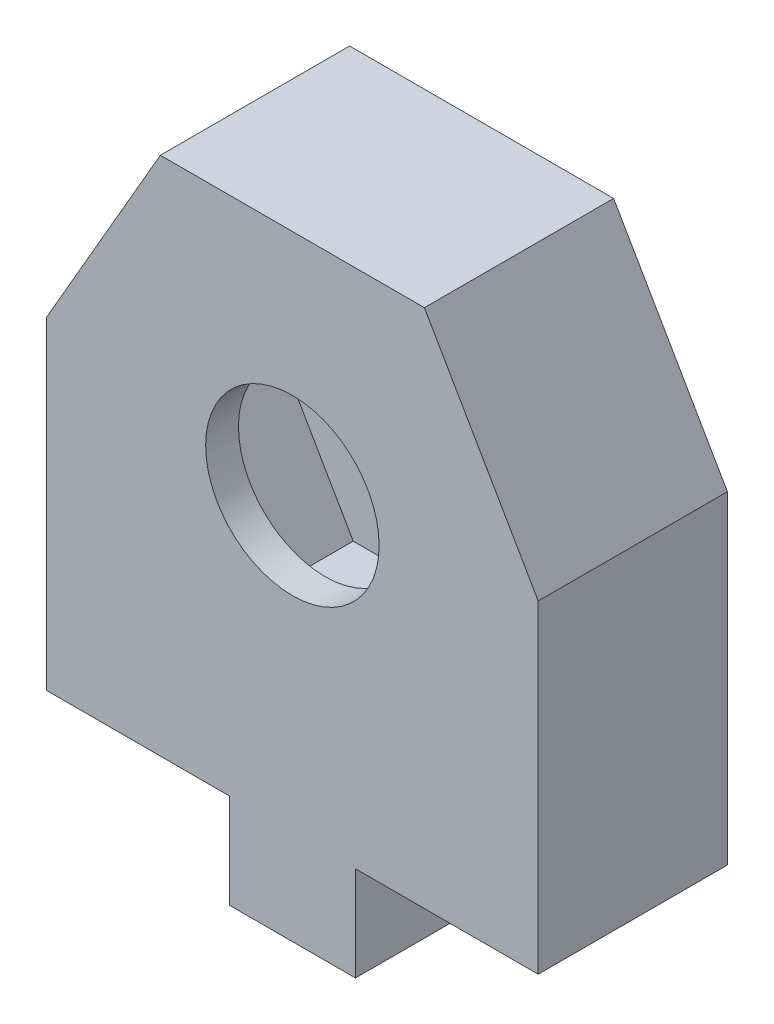
ISO-10303-21;
HEADER;
FILE_DESCRIPTION(('STEP AP214'),'2;1');
FILE_NAME('part.step','',(''),(''),'','','');
FILE_SCHEMA(('AUTOMOTIVE_DESIGN { 1 0 10303 214 1 1 1 1 }'));
ENDSEC;
DATA;
#1=APPLICATION_CONTEXT('core data for automotive mechanical design processes');
#2=APPLICATION_PROTOCOL_DEFINITION('international standard','automotive_design',2000,#1);
#3=PRODUCT_CONTEXT('',#1,'mechanical');
#4=PRODUCT('Part','Part','',(#3));
#5=PRODUCT_RELATED_PRODUCT_CATEGORY('part','',(#4));
#6=PRODUCT_DEFINITION_FORMATION('','',#4);
#7=PRODUCT_DEFINITION_CONTEXT('part definition',#1,'design');
#8=PRODUCT_DEFINITION('design','',#6,#7);
#9=PRODUCT_DEFINITION_SHAPE('','',#8);
#10=(LENGTH_UNIT() NAMED_UNIT(*) SI_UNIT(.MILLI.,.METRE.));
#11=(NAMED_UNIT(*) PLANE_ANGLE_UNIT() SI_UNIT($,.RADIAN.));
#12=(NAMED_UNIT(*) SI_UNIT($,.STERADIAN.) SOLID_ANGLE_UNIT());
#13=UNCERTAINTY_MEASURE_WITH_UNIT(LENGTH_MEASURE(1.E-05),#10,'distance_accuracy_value','');
#14=(GEOMETRIC_REPRESENTATION_CONTEXT(3) GLOBAL_UNCERTAINTY_ASSIGNED_CONTEXT((#13)) GLOBAL_UNIT_ASSIGNED_CONTEXT((#10,
#11,#12)) REPRESENTATION_CONTEXT('',''));
#15=CARTESIAN_POINT('',(0.,0.,0.));
#16=DIRECTION('',(0.,0.,1.));
#17=DIRECTION('',(1.,0.,0.));
#18=AXIS2_PLACEMENT_3D('',#15,#16,#17);
#19=CARTESIAN_POINT('',(0.,0.,3.));
#20=DIRECTION('',(0.,0.,-1.));
#21=DIRECTION('',(-1.,0.,0.));
#22=AXIS2_PLACEMENT_3D('',#19,#20,#21);
#23=CYLINDRICAL_SURFACE('',#22,1.375);
#24=CARTESIAN_POINT('',(0.,0.,0.));
#25=DIRECTION('',(0.,0.,1.));
#26=DIRECTION('',(1.,0.,0.));
#27=AXIS2_PLACEMENT_3D('',#24,#25,#26);
#28=CIRCLE('',#27,1.375);
#29=CARTESIAN_POINT('',(1.375,0.,0.));
#30=VERTEX_POINT('',#29);
#31=EDGE_CURVE('E200',#30,#30,#28,.T.);
#32=ORIENTED_EDGE('',*,*,#31,.F.);
#33=EDGE_LOOP('',(#32));
#34=FACE_BOUND('',#33,.T.);
#35=CARTESIAN_POINT('',(0.,0.,0.52));
#36=DIRECTION('',(0.,0.,1.));
#37=DIRECTION('',(1.,0.,0.));
#38=AXIS2_PLACEMENT_3D('',#35,#36,#37);
#39=CIRCLE('',#38,1.375);
#40=CARTESIAN_POINT('',(1.375,0.,0.52));
#41=VERTEX_POINT('',#40);
#42=EDGE_CURVE('E44',#41,#41,#39,.T.);
#43=ORIENTED_EDGE('',*,*,#42,.T.);
#44=EDGE_LOOP('',(#43));
#45=FACE_BOUND('',#44,.T.);
#46=ADVANCED_FACE('F41',(#34,#45),#23,.F.);
#47=CARTESIAN_POINT('',(0.,0.,3.));
#48=DIRECTION('',(0.,0.,-1.));
#49=DIRECTION('',(-1.,0.,0.));
#50=AXIS2_PLACEMENT_3D('',#47,#48,#49);
#51=PLANE('',#50);
#52=DIRECTION('',(1.,0.,0.));
#53=VECTOR('',#52,1.);
#54=CARTESIAN_POINT('',(1.,-4.625,3.));
#55=LINE('',#54,#53);
#56=CARTESIAN_POINT('',(1.,-4.625,3.));
#57=VERTEX_POINT('',#56);
#58=CARTESIAN_POINT('',(3.89711431702998,-4.625,3.));
#59=VERTEX_POINT('',#58);
#60=EDGE_CURVE('E176',#57,#59,#55,.T.);
#61=ORIENTED_EDGE('',*,*,#60,.T.);
#62=DIRECTION('',(0.,1.,0.));
#63=VECTOR('',#62,1.);
#64=CARTESIAN_POINT('',(3.89711431702998,0.5,3.));
#65=LINE('',#64,#63);
#66=CARTESIAN_POINT('',(3.89711431702998,0.5,3.));
#67=VERTEX_POINT('',#66);
#68=EDGE_CURVE('E109',#59,#67,#65,.T.);
#69=ORIENTED_EDGE('',*,*,#68,.T.);
#70=DIRECTION('',(-0.5,0.866025403784439,0.));
#71=VECTOR('',#70,1.);
#72=CARTESIAN_POINT('',(3.89711431702998,0.5,3.));
#73=LINE('',#72,#71);
#74=CARTESIAN_POINT('',(2.09289472581239,3.625,3.));
#75=VERTEX_POINT('',#74);
#76=EDGE_CURVE('E232',#67,#75,#73,.T.);
#77=ORIENTED_EDGE('',*,*,#76,.T.);
#78=DIRECTION('',(-1.,0.,0.));
#79=VECTOR('',#78,1.);
#80=CARTESIAN_POINT('',(2.09289472581239,3.625,3.));
#81=LINE('',#80,#79);
#82=CARTESIAN_POINT('',(-2.09289472581239,3.625,3.));
#83=VERTEX_POINT('',#82);
#84=EDGE_CURVE('E234',#75,#83,#81,.T.);
#85=ORIENTED_EDGE('',*,*,#84,.T.);
#86=DIRECTION('',(-0.5,-0.866025403784439,0.));
#87=VECTOR('',#86,1.);
#88=CARTESIAN_POINT('',(-2.09289472581239,3.625,3.));
#89=LINE('',#88,#87);
#90=CARTESIAN_POINT('',(-3.89711431702997,0.500000000000001,3.));
#91=VERTEX_POINT('',#90);
#92=EDGE_CURVE('E240',#83,#91,#89,.T.);
#93=ORIENTED_EDGE('',*,*,#92,.T.);
#94=DIRECTION('',(0.,-1.,0.));
#95=VECTOR('',#94,1.);
#96=CARTESIAN_POINT('',(-3.89711431702997,0.500000000000001,3.));
#97=LINE('',#96,#95);
#98=CARTESIAN_POINT('',(-3.89711431702997,-4.625,3.));
#99=VERTEX_POINT('',#98);
#100=EDGE_CURVE('E239',#91,#99,#97,.T.);
#101=ORIENTED_EDGE('',*,*,#100,.T.);
#102=DIRECTION('',(1.,0.,0.));
#103=VECTOR('',#102,1.);
#104=CARTESIAN_POINT('',(-3.89711431702997,-4.625,3.));
#105=LINE('',#104,#103);
#106=CARTESIAN_POINT('',(-1.,-4.625,3.));
#107=VERTEX_POINT('',#106);
#108=EDGE_CURVE('E138',#99,#107,#105,.T.);
#109=ORIENTED_EDGE('',*,*,#108,.T.);
#110=DIRECTION('',(0.,-1.,0.));
#111=VECTOR('',#110,1.);
#112=CARTESIAN_POINT('',(-1.,-4.625,3.));
#113=LINE('',#112,#111);
#114=CARTESIAN_POINT('',(-0.999999999999999,-6.125,3.));
#115=VERTEX_POINT('',#114);
#116=EDGE_CURVE('E135',#107,#115,#113,.T.);
#117=ORIENTED_EDGE('',*,*,#116,.T.);
#118=DIRECTION('',(1.,0.,0.));
#119=VECTOR('',#118,1.);
#120=CARTESIAN_POINT('',(-0.999999999999999,-6.125,3.));
#121=LINE('',#120,#119);
#122=CARTESIAN_POINT('',(1.,-6.125,3.));
#123=VERTEX_POINT('',#122);
#124=EDGE_CURVE('E140',#115,#123,#121,.T.);
#125=ORIENTED_EDGE('',*,*,#124,.T.);
#126=DIRECTION('',(0.,1.,0.));
#127=VECTOR('',#126,1.);
#128=CARTESIAN_POINT('',(1.,-6.125,3.));
#129=LINE('',#128,#127);
#130=EDGE_CURVE('E58',#123,#57,#129,.T.);
#131=ORIENTED_EDGE('',*,*,#130,.T.);
#132=EDGE_LOOP('',(#61,#69,#77,#85,#93,#101,#109,#117,#125,#131));
#133=FACE_BOUND('',#132,.T.);
#134=CARTESIAN_POINT('',(0.,0.,3.));
#135=DIRECTION('',(0.,0.,1.));
#136=DIRECTION('',(1.,0.,0.));
#137=AXIS2_PLACEMENT_3D('',#134,#135,#136);
#138=CIRCLE('',#137,1.375);
#139=CARTESIAN_POINT('',(1.375,0.,3.));
#140=VERTEX_POINT('',#139);
#141=EDGE_CURVE('E161',#140,#140,#138,.T.);
#142=ORIENTED_EDGE('',*,*,#141,.F.);
#143=EDGE_LOOP('',(#142));
#144=FACE_BOUND('',#143,.T.);
#145=ADVANCED_FACE('F134',(#133,#144),#51,.F.);
#146=CARTESIAN_POINT('',(0.,0.,0.));
#147=DIRECTION('',(0.,0.,-1.));
#148=DIRECTION('',(-1.,0.,0.));
#149=AXIS2_PLACEMENT_3D('',#146,#147,#148);
#150=PLANE('',#149);
#151=DIRECTION('',(1.,0.,0.));
#152=VECTOR('',#151,1.);
#153=CARTESIAN_POINT('',(1.,-4.625,0.));
#154=LINE('',#153,#152);
#155=CARTESIAN_POINT('',(1.,-4.625,0.));
#156=VERTEX_POINT('',#155);
#157=CARTESIAN_POINT('',(3.89711431702998,-4.625,0.));
#158=VERTEX_POINT('',#157);
#159=EDGE_CURVE('E160',#156,#158,#154,.T.);
#160=ORIENTED_EDGE('',*,*,#159,.F.);
#161=DIRECTION('',(0.,1.,0.));
#162=VECTOR('',#161,1.);
#163=CARTESIAN_POINT('',(1.,-6.125,0.));
#164=LINE('',#163,#162);
#165=CARTESIAN_POINT('',(1.,-6.125,0.));
#166=VERTEX_POINT('',#165);
#167=EDGE_CURVE('E105',#166,#156,#164,.T.);
#168=ORIENTED_EDGE('',*,*,#167,.F.);
#169=DIRECTION('',(1.,0.,0.));
#170=VECTOR('',#169,1.);
#171=CARTESIAN_POINT('',(-0.999999999999999,-6.125,0.));
#172=LINE('',#171,#170);
#173=CARTESIAN_POINT('',(-0.999999999999999,-6.125,0.));
#174=VERTEX_POINT('',#173);
#175=EDGE_CURVE('E96',#174,#166,#172,.T.);
#176=ORIENTED_EDGE('',*,*,#175,.F.);
#177=DIRECTION('',(0.,-1.,0.));
#178=VECTOR('',#177,1.);
#179=CARTESIAN_POINT('',(-1.,-4.625,0.));
#180=LINE('',#179,#178);
#181=CARTESIAN_POINT('',(-1.,-4.625,0.));
#182=VERTEX_POINT('',#181);
#183=EDGE_CURVE('E150',#182,#174,#180,.T.);
#184=ORIENTED_EDGE('',*,*,#183,.F.);
#185=DIRECTION('',(1.,0.,0.));
#186=VECTOR('',#185,1.);
#187=CARTESIAN_POINT('',(-3.89711431702997,-4.625,0.));
#188=LINE('',#187,#186);
#189=CARTESIAN_POINT('',(-3.89711431702997,-4.625,0.));
#190=VERTEX_POINT('',#189);
#191=EDGE_CURVE('E172',#190,#182,#188,.T.);
#192=ORIENTED_EDGE('',*,*,#191,.F.);
#193=DIRECTION('',(0.,-1.,0.));
#194=VECTOR('',#193,1.);
#195=CARTESIAN_POINT('',(-3.89711431702997,0.500000000000001,0.));
#196=LINE('',#195,#194);
#197=CARTESIAN_POINT('',(-3.89711431702997,0.500000000000001,0.));
#198=VERTEX_POINT('',#197);
#199=EDGE_CURVE('E166',#198,#190,#196,.T.);
#200=ORIENTED_EDGE('',*,*,#199,.F.);
#201=DIRECTION('',(-0.5,-0.866025403784439,0.));
#202=VECTOR('',#201,1.);
#203=CARTESIAN_POINT('',(-2.09289472581239,3.625,0.));
#204=LINE('',#203,#202);
#205=CARTESIAN_POINT('',(-2.09289472581239,3.625,0.));
#206=VERTEX_POINT('',#205);
#207=EDGE_CURVE('E170',#206,#198,#204,.T.);
#208=ORIENTED_EDGE('',*,*,#207,.F.);
#209=DIRECTION('',(-1.,0.,0.));
#210=VECTOR('',#209,1.);
#211=CARTESIAN_POINT('',(2.09289472581239,3.625,0.));
#212=LINE('',#211,#210);
#213=CARTESIAN_POINT('',(2.09289472581239,3.625,0.));
#214=VERTEX_POINT('',#213);
#215=EDGE_CURVE('E164',#214,#206,#212,.T.);
#216=ORIENTED_EDGE('',*,*,#215,.F.);
#217=DIRECTION('',(-0.5,0.866025403784439,0.));
#218=VECTOR('',#217,1.);
#219=CARTESIAN_POINT('',(3.89711431702998,0.5,0.));
#220=LINE('',#219,#218);
#221=CARTESIAN_POINT('',(3.89711431702998,0.5,0.));
#222=VERTEX_POINT('',#221);
#223=EDGE_CURVE('E162',#222,#214,#220,.T.);
#224=ORIENTED_EDGE('',*,*,#223,.F.);
#225=DIRECTION('',(0.,1.,0.));
#226=VECTOR('',#225,1.);
#227=CARTESIAN_POINT('',(3.89711431702998,0.5,0.));
#228=LINE('',#227,#226);
#229=EDGE_CURVE('E159',#158,#222,#228,.T.);
#230=ORIENTED_EDGE('',*,*,#229,.F.);
#231=EDGE_LOOP('',(#160,#168,#176,#184,#192,#200,#208,#216,#224,#230));
#232=FACE_BOUND('',#231,.T.);
#233=ORIENTED_EDGE('',*,*,#31,.T.);
#234=EDGE_LOOP('',(#233));
#235=FACE_BOUND('',#234,.T.);
#236=ADVANCED_FACE('F252',(#232,#235),#150,.T.);
#237=CARTESIAN_POINT('',(1.,-4.625,3.));
#238=DIRECTION('',(0.,1.,0.));
#239=DIRECTION('',(-1.,0.,0.));
#240=AXIS2_PLACEMENT_3D('',#237,#238,#239);
#241=PLANE('',#240);
#242=ORIENTED_EDGE('',*,*,#159,.T.);
#243=DIRECTION('',(0.,0.,-1.));
#244=VECTOR('',#243,1.);
#245=CARTESIAN_POINT('',(3.89711431702998,-4.625,3.));
#246=LINE('',#245,#244);
#247=EDGE_CURVE('E11',#59,#158,#246,.T.);
#248=ORIENTED_EDGE('',*,*,#247,.F.);
#249=ORIENTED_EDGE('',*,*,#60,.F.);
#250=DIRECTION('',(0.,0.,-1.));
#251=VECTOR('',#250,1.);
#252=CARTESIAN_POINT('',(1.,-4.625,3.));
#253=LINE('',#252,#251);
#254=EDGE_CURVE('E153',#57,#156,#253,.T.);
#255=ORIENTED_EDGE('',*,*,#254,.T.);
#256=EDGE_LOOP('',(#242,#248,#249,#255));
#257=FACE_BOUND('',#256,.T.);
#258=ADVANCED_FACE('F43',(#257),#241,.F.);
#259=CARTESIAN_POINT('',(3.89711431702998,0.5,3.));
#260=DIRECTION('',(-1.,0.,0.));
#261=DIRECTION('',(0.,-1.,0.));
#262=AXIS2_PLACEMENT_3D('',#259,#260,#261);
#263=PLANE('',#262);
#264=ORIENTED_EDGE('',*,*,#229,.T.);
#265=DIRECTION('',(0.,0.,-1.));
#266=VECTOR('',#265,1.);
#267=CARTESIAN_POINT('',(3.89711431702998,0.5,3.));
#268=LINE('',#267,#266);
#269=EDGE_CURVE('E51',#67,#222,#268,.T.);
#270=ORIENTED_EDGE('',*,*,#269,.F.);
#271=ORIENTED_EDGE('',*,*,#68,.F.);
#272=ORIENTED_EDGE('',*,*,#247,.T.);
#273=EDGE_LOOP('',(#264,#270,#271,#272));
#274=FACE_BOUND('',#273,.T.);
#275=ADVANCED_FACE('F281',(#274),#263,.F.);
#276=CARTESIAN_POINT('',(3.89711431702998,0.5,3.));
#277=DIRECTION('',(-0.866025403784439,-0.5,0.));
#278=DIRECTION('',(0.5,-0.866025403784439,0.));
#279=AXIS2_PLACEMENT_3D('',#276,#277,#278);
#280=PLANE('',#279);
#281=ORIENTED_EDGE('',*,*,#223,.T.);
#282=DIRECTION('',(0.,0.,-1.));
#283=VECTOR('',#282,1.);
#284=CARTESIAN_POINT('',(2.09289472581239,3.625,3.));
#285=LINE('',#284,#283);
#286=EDGE_CURVE('E189',#75,#214,#285,.T.);
#287=ORIENTED_EDGE('',*,*,#286,.F.);
#288=ORIENTED_EDGE('',*,*,#76,.F.);
#289=ORIENTED_EDGE('',*,*,#269,.T.);
#290=EDGE_LOOP('',(#281,#287,#288,#289));
#291=FACE_BOUND('',#290,.T.);
#292=ADVANCED_FACE('F288',(#291),#280,.F.);
#293=CARTESIAN_POINT('',(2.09289472581239,3.625,3.));
#294=DIRECTION('',(0.,-1.,0.));
#295=DIRECTION('',(0.,0.,-1.));
#296=AXIS2_PLACEMENT_3D('',#293,#294,#295);
#297=PLANE('',#296);
#298=ORIENTED_EDGE('',*,*,#215,.T.);
#299=DIRECTION('',(0.,0.,-1.));
#300=VECTOR('',#299,1.);
#301=CARTESIAN_POINT('',(-2.09289472581239,3.625,3.));
#302=LINE('',#301,#300);
#303=EDGE_CURVE('E187',#83,#206,#302,.T.);
#304=ORIENTED_EDGE('',*,*,#303,.F.);
#305=ORIENTED_EDGE('',*,*,#84,.F.);
#306=ORIENTED_EDGE('',*,*,#286,.T.);
#307=EDGE_LOOP('',(#298,#304,#305,#306));
#308=FACE_BOUND('',#307,.T.);
#309=ADVANCED_FACE('F291',(#308),#297,.F.);
#310=CARTESIAN_POINT('',(-2.09289472581239,3.625,3.));
#311=DIRECTION('',(0.866025403784439,-0.5,0.));
#312=DIRECTION('',(0.5,0.866025403784439,0.));
#313=AXIS2_PLACEMENT_3D('',#310,#311,#312);
#314=PLANE('',#313);
#315=ORIENTED_EDGE('',*,*,#207,.T.);
#316=DIRECTION('',(0.,0.,-1.));
#317=VECTOR('',#316,1.);
#318=CARTESIAN_POINT('',(-3.89711431702997,0.500000000000001,3.));
#319=LINE('',#318,#317);
#320=EDGE_CURVE('E181',#91,#198,#319,.T.);
#321=ORIENTED_EDGE('',*,*,#320,.F.);
#322=ORIENTED_EDGE('',*,*,#92,.F.);
#323=ORIENTED_EDGE('',*,*,#303,.T.);
#324=EDGE_LOOP('',(#315,#321,#322,#323));
#325=FACE_BOUND('',#324,.T.);
#326=ADVANCED_FACE('F299',(#325),#314,.F.);
#327=CARTESIAN_POINT('',(-3.89711431702997,0.500000000000001,3.));
#328=DIRECTION('',(1.,0.,0.));
#329=DIRECTION('',(0.,0.,-1.));
#330=AXIS2_PLACEMENT_3D('',#327,#328,#329);
#331=PLANE('',#330);
#332=ORIENTED_EDGE('',*,*,#199,.T.);
#333=DIRECTION('',(0.,0.,-1.));
#334=VECTOR('',#333,1.);
#335=CARTESIAN_POINT('',(-3.89711431702997,-4.625,3.));
#336=LINE('',#335,#334);
#337=EDGE_CURVE('E179',#99,#190,#336,.T.);
#338=ORIENTED_EDGE('',*,*,#337,.F.);
#339=ORIENTED_EDGE('',*,*,#100,.F.);
#340=ORIENTED_EDGE('',*,*,#320,.T.);
#341=EDGE_LOOP('',(#332,#338,#339,#340));
#342=FACE_BOUND('',#341,.T.);
#343=ADVANCED_FACE('F241',(#342),#331,.F.);
#344=CARTESIAN_POINT('',(-3.89711431702997,-4.625,3.));
#345=DIRECTION('',(0.,1.,0.));
#346=DIRECTION('',(0.,0.,1.));
#347=AXIS2_PLACEMENT_3D('',#344,#345,#346);
#348=PLANE('',#347);
#349=ORIENTED_EDGE('',*,*,#191,.T.);
#350=DIRECTION('',(0.,0.,-1.));
#351=VECTOR('',#350,1.);
#352=CARTESIAN_POINT('',(-1.,-4.625,3.));
#353=LINE('',#352,#351);
#354=EDGE_CURVE('E146',#107,#182,#353,.T.);
#355=ORIENTED_EDGE('',*,*,#354,.F.);
#356=ORIENTED_EDGE('',*,*,#108,.F.);
#357=ORIENTED_EDGE('',*,*,#337,.T.);
#358=EDGE_LOOP('',(#349,#355,#356,#357));
#359=FACE_BOUND('',#358,.T.);
#360=ADVANCED_FACE('F248',(#359),#348,.F.);
#361=CARTESIAN_POINT('',(-1.,-4.625,3.));
#362=DIRECTION('',(1.,0.,0.));
#363=DIRECTION('',(0.,1.,0.));
#364=AXIS2_PLACEMENT_3D('',#361,#362,#363);
#365=PLANE('',#364);
#366=ORIENTED_EDGE('',*,*,#183,.T.);
#367=DIRECTION('',(0.,0.,-1.));
#368=VECTOR('',#367,1.);
#369=CARTESIAN_POINT('',(-0.999999999999999,-6.125,3.));
#370=LINE('',#369,#368);
#371=EDGE_CURVE('E145',#115,#174,#370,.T.);
#372=ORIENTED_EDGE('',*,*,#371,.F.);
#373=ORIENTED_EDGE('',*,*,#116,.F.);
#374=ORIENTED_EDGE('',*,*,#354,.T.);
#375=EDGE_LOOP('',(#366,#372,#373,#374));
#376=FACE_BOUND('',#375,.T.);
#377=ADVANCED_FACE('F144',(#376),#365,.F.);
#378=CARTESIAN_POINT('',(-0.999999999999999,-6.125,3.));
#379=DIRECTION('',(0.,1.,0.));
#380=DIRECTION('',(0.,0.,1.));
#381=AXIS2_PLACEMENT_3D('',#378,#379,#380);
#382=PLANE('',#381);
#383=ORIENTED_EDGE('',*,*,#175,.T.);
#384=DIRECTION('',(0.,0.,-1.));
#385=VECTOR('',#384,1.);
#386=CARTESIAN_POINT('',(1.,-6.125,3.));
#387=LINE('',#386,#385);
#388=EDGE_CURVE('E149',#123,#166,#387,.T.);
#389=ORIENTED_EDGE('',*,*,#388,.F.);
#390=ORIENTED_EDGE('',*,*,#124,.F.);
#391=ORIENTED_EDGE('',*,*,#371,.T.);
#392=EDGE_LOOP('',(#383,#389,#390,#391));
#393=FACE_BOUND('',#392,.T.);
#394=ADVANCED_FACE('F151',(#393),#382,.F.);
#395=CARTESIAN_POINT('',(1.,-6.125,3.));
#396=DIRECTION('',(-1.,0.,0.));
#397=DIRECTION('',(0.,0.,1.));
#398=AXIS2_PLACEMENT_3D('',#395,#396,#397);
#399=PLANE('',#398);
#400=ORIENTED_EDGE('',*,*,#167,.T.);
#401=ORIENTED_EDGE('',*,*,#254,.F.);
#402=ORIENTED_EDGE('',*,*,#130,.F.);
#403=ORIENTED_EDGE('',*,*,#388,.T.);
#404=EDGE_LOOP('',(#400,#401,#402,#403));
#405=FACE_BOUND('',#404,.T.);
#406=ADVANCED_FACE('F256',(#405),#399,.F.);
#407=CARTESIAN_POINT('',(0.,0.,2.48));
#408=DIRECTION('',(0.,0.,1.));
#409=DIRECTION('',(1.,0.,0.));
#410=AXIS2_PLACEMENT_3D('',#407,#408,#409);
#411=CIRCLE('',#410,1.375);
#412=CARTESIAN_POINT('',(1.375,0.,2.48));
#413=VERTEX_POINT('',#412);
#414=EDGE_CURVE('E192',#413,#413,#411,.T.);
#415=ORIENTED_EDGE('',*,*,#414,.F.);
#416=EDGE_LOOP('',(#415));
#417=FACE_BOUND('',#416,.T.);
#418=ORIENTED_EDGE('',*,*,#141,.T.);
#419=EDGE_LOOP('',(#418));
#420=FACE_BOUND('',#419,.T.);
#421=ADVANCED_FACE('F257',(#417,#420),#23,.F.);
#422=CARTESIAN_POINT('',(-3.03108891324554,0.,0.52));
#423=DIRECTION('',(-0.866025403784439,-0.5,0.));
#424=DIRECTION('',(0.5,-0.866025403784439,0.));
#425=AXIS2_PLACEMENT_3D('',#422,#423,#424);
#426=PLANE('',#425);
#427=DIRECTION('',(0.5,-0.866025403784439,0.));
#428=VECTOR('',#427,1.);
#429=CARTESIAN_POINT('',(-3.03108891324554,0.,2.48));
#430=LINE('',#429,#428);
#431=CARTESIAN_POINT('',(-3.03108891324554,0.,2.48));
#432=VERTEX_POINT('',#431);
#433=CARTESIAN_POINT('',(-1.51554445662277,-2.625,2.48));
#434=VERTEX_POINT('',#433);
#435=EDGE_CURVE('E413',#432,#434,#430,.T.);
#436=ORIENTED_EDGE('',*,*,#435,.T.);
#437=DIRECTION('',(0.,0.,1.));
#438=VECTOR('',#437,1.);
#439=CARTESIAN_POINT('',(-1.51554445662277,-2.625,0.52));
#440=LINE('',#439,#438);
#441=CARTESIAN_POINT('',(-1.51554445662277,-2.625,0.52));
#442=VERTEX_POINT('',#441);
#443=EDGE_CURVE('E224',#442,#434,#440,.T.);
#444=ORIENTED_EDGE('',*,*,#443,.F.);
#445=DIRECTION('',(0.5,-0.866025403784439,0.));
#446=VECTOR('',#445,1.);
#447=CARTESIAN_POINT('',(-3.03108891324554,0.,0.52));
#448=LINE('',#447,#446);
#449=CARTESIAN_POINT('',(-3.03108891324554,0.,0.52));
#450=VERTEX_POINT('',#449);
#451=EDGE_CURVE('E428',#450,#442,#448,.T.);
#452=ORIENTED_EDGE('',*,*,#451,.F.);
#453=DIRECTION('',(0.,0.,1.));
#454=VECTOR('',#453,1.);
#455=CARTESIAN_POINT('',(-3.03108891324554,0.,0.52));
#456=LINE('',#455,#454);
#457=EDGE_CURVE('E194',#450,#432,#456,.T.);
#458=ORIENTED_EDGE('',*,*,#457,.T.);
#459=EDGE_LOOP('',(#436,#444,#452,#458));
#460=FACE_BOUND('',#459,.T.);
#461=ADVANCED_FACE('F270',(#460),#426,.F.);
#462=CARTESIAN_POINT('',(-1.51554445662277,2.625,0.52));
#463=DIRECTION('',(-0.866025403784439,0.5,0.));
#464=DIRECTION('',(-0.5,-0.866025403784439,0.));
#465=AXIS2_PLACEMENT_3D('',#462,#463,#464);
#466=PLANE('',#465);
#467=DIRECTION('',(-0.5,-0.866025403784439,0.));
#468=VECTOR('',#467,1.);
#469=CARTESIAN_POINT('',(-1.51554445662277,2.625,2.48));
#470=LINE('',#469,#468);
#471=CARTESIAN_POINT('',(-1.51554445662277,2.625,2.48));
#472=VERTEX_POINT('',#471);
#473=EDGE_CURVE('E215',#472,#432,#470,.T.);
#474=ORIENTED_EDGE('',*,*,#473,.T.);
#475=ORIENTED_EDGE('',*,*,#457,.F.);
#476=DIRECTION('',(-0.5,-0.866025403784439,0.));
#477=VECTOR('',#476,1.);
#478=CARTESIAN_POINT('',(-1.51554445662277,2.625,0.52));
#479=LINE('',#478,#477);
#480=CARTESIAN_POINT('',(-1.51554445662277,2.625,0.52));
#481=VERTEX_POINT('',#480);
#482=EDGE_CURVE('E227',#481,#450,#479,.T.);
#483=ORIENTED_EDGE('',*,*,#482,.F.);
#484=DIRECTION('',(0.,0.,1.));
#485=VECTOR('',#484,1.);
#486=CARTESIAN_POINT('',(-1.51554445662277,2.625,0.52));
#487=LINE('',#486,#485);
#488=EDGE_CURVE('E203',#481,#472,#487,.T.);
#489=ORIENTED_EDGE('',*,*,#488,.T.);
#490=EDGE_LOOP('',(#474,#475,#483,#489));
#491=FACE_BOUND('',#490,.T.);
#492=ADVANCED_FACE('F345',(#491),#466,.F.);
#493=CARTESIAN_POINT('',(1.51554445662277,2.625,0.52));
#494=DIRECTION('',(0.,1.,0.));
#495=DIRECTION('',(0.,0.,1.));
#496=AXIS2_PLACEMENT_3D('',#493,#494,#495);
#497=PLANE('',#496);
#498=DIRECTION('',(-1.,0.,0.));
#499=VECTOR('',#498,1.);
#500=CARTESIAN_POINT('',(1.51554445662277,2.625,2.48));
#501=LINE('',#500,#499);
#502=CARTESIAN_POINT('',(1.51554445662277,2.625,2.48));
#503=VERTEX_POINT('',#502);
#504=EDGE_CURVE('E427',#503,#472,#501,.T.);
#505=ORIENTED_EDGE('',*,*,#504,.T.);
#506=ORIENTED_EDGE('',*,*,#488,.F.);
#507=DIRECTION('',(-1.,0.,0.));
#508=VECTOR('',#507,1.);
#509=CARTESIAN_POINT('',(1.51554445662277,2.625,0.52));
#510=LINE('',#509,#508);
#511=CARTESIAN_POINT('',(1.51554445662277,2.625,0.52));
#512=VERTEX_POINT('',#511);
#513=EDGE_CURVE('E444',#512,#481,#510,.T.);
#514=ORIENTED_EDGE('',*,*,#513,.F.);
#515=DIRECTION('',(0.,0.,1.));
#516=VECTOR('',#515,1.);
#517=CARTESIAN_POINT('',(1.51554445662277,2.625,0.52));
#518=LINE('',#517,#516);
#519=EDGE_CURVE('E207',#512,#503,#518,.T.);
#520=ORIENTED_EDGE('',*,*,#519,.T.);
#521=EDGE_LOOP('',(#505,#506,#514,#520));
#522=FACE_BOUND('',#521,.T.);
#523=ADVANCED_FACE('F348',(#522),#497,.F.);
#524=CARTESIAN_POINT('',(3.03108891324554,0.,0.52));
#525=DIRECTION('',(0.866025403784439,0.5,0.));
#526=DIRECTION('',(-0.5,0.866025403784439,0.));
#527=AXIS2_PLACEMENT_3D('',#524,#525,#526);
#528=PLANE('',#527);
#529=DIRECTION('',(-0.5,0.866025403784439,0.));
#530=VECTOR('',#529,1.);
#531=CARTESIAN_POINT('',(3.03108891324554,0.,2.48));
#532=LINE('',#531,#530);
#533=CARTESIAN_POINT('',(3.03108891324554,0.,2.48));
#534=VERTEX_POINT('',#533);
#535=EDGE_CURVE('E433',#534,#503,#532,.T.);
#536=ORIENTED_EDGE('',*,*,#535,.T.);
#537=ORIENTED_EDGE('',*,*,#519,.F.);
#538=DIRECTION('',(-0.5,0.866025403784439,0.));
#539=VECTOR('',#538,1.);
#540=CARTESIAN_POINT('',(3.03108891324554,0.,0.52));
#541=LINE('',#540,#539);
#542=CARTESIAN_POINT('',(3.03108891324554,0.,0.52));
#543=VERTEX_POINT('',#542);
#544=EDGE_CURVE('E447',#543,#512,#541,.T.);
#545=ORIENTED_EDGE('',*,*,#544,.F.);
#546=DIRECTION('',(0.,0.,1.));
#547=VECTOR('',#546,1.);
#548=CARTESIAN_POINT('',(3.03108891324554,0.,0.52));
#549=LINE('',#548,#547);
#550=EDGE_CURVE('E220',#543,#534,#549,.T.);
#551=ORIENTED_EDGE('',*,*,#550,.T.);
#552=EDGE_LOOP('',(#536,#537,#545,#551));
#553=FACE_BOUND('',#552,.T.);
#554=ADVANCED_FACE('F359',(#553),#528,.F.);
#555=CARTESIAN_POINT('',(1.51554445662277,-2.625,0.52));
#556=DIRECTION('',(0.866025403784439,-0.5,0.));
#557=DIRECTION('',(0.5,0.866025403784439,0.));
#558=AXIS2_PLACEMENT_3D('',#555,#556,#557);
#559=PLANE('',#558);
#560=DIRECTION('',(0.5,0.866025403784439,0.));
#561=VECTOR('',#560,1.);
#562=CARTESIAN_POINT('',(1.51554445662277,-2.625,2.48));
#563=LINE('',#562,#561);
#564=CARTESIAN_POINT('',(1.51554445662277,-2.625,2.48));
#565=VERTEX_POINT('',#564);
#566=EDGE_CURVE('E434',#565,#534,#563,.T.);
#567=ORIENTED_EDGE('',*,*,#566,.T.);
#568=ORIENTED_EDGE('',*,*,#550,.F.);
#569=DIRECTION('',(0.5,0.866025403784439,0.));
#570=VECTOR('',#569,1.);
#571=CARTESIAN_POINT('',(1.51554445662277,-2.625,0.52));
#572=LINE('',#571,#570);
#573=CARTESIAN_POINT('',(1.51554445662277,-2.625,0.52));
#574=VERTEX_POINT('',#573);
#575=EDGE_CURVE('E449',#574,#543,#572,.T.);
#576=ORIENTED_EDGE('',*,*,#575,.F.);
#577=DIRECTION('',(0.,0.,1.));
#578=VECTOR('',#577,1.);
#579=CARTESIAN_POINT('',(1.51554445662277,-2.625,0.52));
#580=LINE('',#579,#578);
#581=EDGE_CURVE('E219',#574,#565,#580,.T.);
#582=ORIENTED_EDGE('',*,*,#581,.T.);
#583=EDGE_LOOP('',(#567,#568,#576,#582));
#584=FACE_BOUND('',#583,.T.);
#585=ADVANCED_FACE('F367',(#584),#559,.F.);
#586=CARTESIAN_POINT('',(-1.51554445662277,-2.625,0.52));
#587=DIRECTION('',(0.,-1.,0.));
#588=DIRECTION('',(0.,0.,-1.));
#589=AXIS2_PLACEMENT_3D('',#586,#587,#588);
#590=PLANE('',#589);
#591=DIRECTION('',(1.,0.,0.));
#592=VECTOR('',#591,1.);
#593=CARTESIAN_POINT('',(-1.51554445662277,-2.625,2.48));
#594=LINE('',#593,#592);
#595=EDGE_CURVE('E423',#434,#565,#594,.T.);
#596=ORIENTED_EDGE('',*,*,#595,.T.);
#597=ORIENTED_EDGE('',*,*,#581,.F.);
#598=DIRECTION('',(1.,0.,0.));
#599=VECTOR('',#598,1.);
#600=CARTESIAN_POINT('',(-1.51554445662277,-2.625,0.52));
#601=LINE('',#600,#599);
#602=EDGE_CURVE('E431',#442,#574,#601,.T.);
#603=ORIENTED_EDGE('',*,*,#602,.F.);
#604=ORIENTED_EDGE('',*,*,#443,.T.);
#605=EDGE_LOOP('',(#596,#597,#603,#604));
#606=FACE_BOUND('',#605,.T.);
#607=ADVANCED_FACE('F379',(#606),#590,.F.);
#608=CARTESIAN_POINT('',(0.,0.,0.52));
#609=DIRECTION('',(0.,0.,1.));
#610=DIRECTION('',(1.,0.,0.));
#611=AXIS2_PLACEMENT_3D('',#608,#609,#610);
#612=PLANE('',#611);
#613=ORIENTED_EDGE('',*,*,#42,.F.);
#614=EDGE_LOOP('',(#613));
#615=FACE_BOUND('',#614,.T.);
#616=ORIENTED_EDGE('',*,*,#451,.T.);
#617=ORIENTED_EDGE('',*,*,#602,.T.);
#618=ORIENTED_EDGE('',*,*,#575,.T.);
#619=ORIENTED_EDGE('',*,*,#544,.T.);
#620=ORIENTED_EDGE('',*,*,#513,.T.);
#621=ORIENTED_EDGE('',*,*,#482,.T.);
#622=EDGE_LOOP('',(#616,#617,#618,#619,#620,#621));
#623=FACE_BOUND('',#622,.T.);
#624=ADVANCED_FACE('F388',(#615,#623),#612,.T.);
#625=CARTESIAN_POINT('',(0.,0.,2.48));
#626=DIRECTION('',(0.,0.,1.));
#627=DIRECTION('',(1.,0.,0.));
#628=AXIS2_PLACEMENT_3D('',#625,#626,#627);
#629=PLANE('',#628);
#630=ORIENTED_EDGE('',*,*,#414,.T.);
#631=EDGE_LOOP('',(#630));
#632=FACE_BOUND('',#631,.T.);
#633=ORIENTED_EDGE('',*,*,#435,.F.);
#634=ORIENTED_EDGE('',*,*,#473,.F.);
#635=ORIENTED_EDGE('',*,*,#504,.F.);
#636=ORIENTED_EDGE('',*,*,#535,.F.);
#637=ORIENTED_EDGE('',*,*,#566,.F.);
#638=ORIENTED_EDGE('',*,*,#595,.F.);
#639=EDGE_LOOP('',(#633,#634,#635,#636,#637,#638));
#640=FACE_BOUND('',#639,.T.);
#641=ADVANCED_FACE('F398',(#632,#640),#629,.F.);
#642=CLOSED_SHELL('',(#46,#145,#236,#258,#275,#292,#309,#326,#343,#360,#377,#394,#406,#421,#461,
#492,#523,#554,#585,#607,#624,#641));
#643=MANIFOLD_SOLID_BREP('B2',#642);
#644=ADVANCED_BREP_SHAPE_REPRESENTATION('',(#18,#643),#14);
#645=SHAPE_DEFINITION_REPRESENTATION(#9,#644);
ENDSEC;
END-ISO-10303-21;
